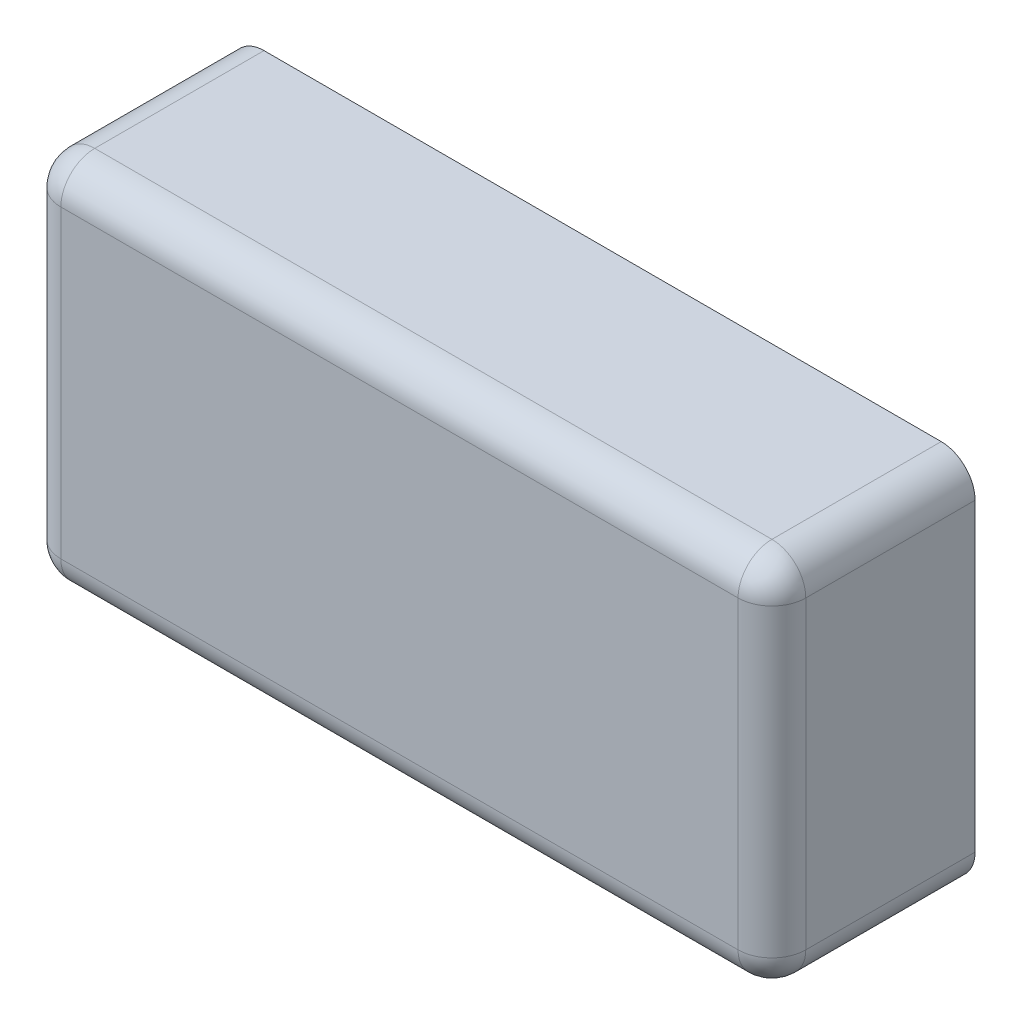
ISO-10303-21;
HEADER;
FILE_DESCRIPTION(('STEP AP214'),'2;1');
FILE_NAME('part.step','',(''),(''),'','','');
FILE_SCHEMA(('AUTOMOTIVE_DESIGN { 1 0 10303 214 1 1 1 1 }'));
ENDSEC;
DATA;
#1=APPLICATION_CONTEXT('core data for automotive mechanical design processes');
#2=APPLICATION_PROTOCOL_DEFINITION('international standard','automotive_design',2000,#1);
#3=PRODUCT_CONTEXT('',#1,'mechanical');
#4=PRODUCT('Part','Part','',(#3));
#5=PRODUCT_RELATED_PRODUCT_CATEGORY('part','',(#4));
#6=PRODUCT_DEFINITION_FORMATION('','',#4);
#7=PRODUCT_DEFINITION_CONTEXT('part definition',#1,'design');
#8=PRODUCT_DEFINITION('design','',#6,#7);
#9=PRODUCT_DEFINITION_SHAPE('','',#8);
#10=(LENGTH_UNIT() NAMED_UNIT(*) SI_UNIT(.MILLI.,.METRE.));
#11=(NAMED_UNIT(*) PLANE_ANGLE_UNIT() SI_UNIT($,.RADIAN.));
#12=(NAMED_UNIT(*) SI_UNIT($,.STERADIAN.) SOLID_ANGLE_UNIT());
#13=UNCERTAINTY_MEASURE_WITH_UNIT(LENGTH_MEASURE(1.E-05),#10,'distance_accuracy_value','');
#14=(GEOMETRIC_REPRESENTATION_CONTEXT(3) GLOBAL_UNCERTAINTY_ASSIGNED_CONTEXT((#13)) GLOBAL_UNIT_ASSIGNED_CONTEXT((#10,
#11,#12)) REPRESENTATION_CONTEXT('',''));
#15=CARTESIAN_POINT('',(0.,0.,0.));
#16=DIRECTION('',(0.,0.,1.));
#17=DIRECTION('',(1.,0.,0.));
#18=AXIS2_PLACEMENT_3D('',#15,#16,#17);
#19=CARTESIAN_POINT('',(-49.060650887574,24.5710059171598,30.));
#20=DIRECTION('',(1.,0.,0.));
#21=DIRECTION('',(0.,1.,0.));
#22=AXIS2_PLACEMENT_3D('',#19,#20,#21);
#23=PLANE('',#22);
#24=DIRECTION('',(0.,-1.,0.));
#25=VECTOR('',#24,1.);
#26=CARTESIAN_POINT('',(-49.060650887574,24.5710059171598,0.));
#27=LINE('',#26,#25);
#28=CARTESIAN_POINT('',(-49.060650887574,19.5710059171598,0.));
#29=VERTEX_POINT('',#28);
#30=CARTESIAN_POINT('',(-49.060650887574,-25.4289940828402,0.));
#31=VERTEX_POINT('',#30);
#32=EDGE_CURVE('E142',#29,#31,#27,.T.);
#33=ORIENTED_EDGE('',*,*,#32,.T.);
#34=DIRECTION('',(0.,0.,-1.));
#35=VECTOR('',#34,1.);
#36=CARTESIAN_POINT('',(-49.060650887574,-25.4289940828402,30.));
#37=LINE('',#36,#35);
#38=CARTESIAN_POINT('',(-49.060650887574,-25.4289940828402,25.));
#39=VERTEX_POINT('',#38);
#40=EDGE_CURVE('E159',#31,#39,#37,.F.);
#41=ORIENTED_EDGE('',*,*,#40,.T.);
#42=DIRECTION('',(0.,-1.,0.));
#43=VECTOR('',#42,1.);
#44=CARTESIAN_POINT('',(-49.060650887574,24.5710059171598,25.));
#45=LINE('',#44,#43);
#46=CARTESIAN_POINT('',(-49.060650887574,19.5710059171598,25.));
#47=VERTEX_POINT('',#46);
#48=EDGE_CURVE('E155',#39,#47,#45,.F.);
#49=ORIENTED_EDGE('',*,*,#48,.T.);
#50=DIRECTION('',(0.,0.,-1.));
#51=VECTOR('',#50,1.);
#52=CARTESIAN_POINT('',(-49.060650887574,19.5710059171598,30.));
#53=LINE('',#52,#51);
#54=EDGE_CURVE('E157',#47,#29,#53,.T.);
#55=ORIENTED_EDGE('',*,*,#54,.T.);
#56=EDGE_LOOP('',(#33,#41,#49,#55));
#57=FACE_BOUND('',#56,.T.);
#58=ADVANCED_FACE('F33',(#57),#23,.F.);
#59=CARTESIAN_POINT('',(-49.060650887574,-30.4289940828402,30.));
#60=DIRECTION('',(0.,1.,0.));
#61=DIRECTION('',(0.,0.,1.));
#62=AXIS2_PLACEMENT_3D('',#59,#60,#61);
#63=PLANE('',#62);
#64=DIRECTION('',(1.,0.,0.));
#65=VECTOR('',#64,1.);
#66=CARTESIAN_POINT('',(-49.060650887574,-30.4289940828402,0.));
#67=LINE('',#66,#65);
#68=CARTESIAN_POINT('',(-44.060650887574,-30.4289940828402,0.));
#69=VERTEX_POINT('',#68);
#70=CARTESIAN_POINT('',(55.939349112426,-30.4289940828402,0.));
#71=VERTEX_POINT('',#70);
#72=EDGE_CURVE('E138',#69,#71,#67,.T.);
#73=ORIENTED_EDGE('',*,*,#72,.T.);
#74=DIRECTION('',(0.,0.,-1.));
#75=VECTOR('',#74,1.);
#76=CARTESIAN_POINT('',(55.939349112426,-30.4289940828402,30.));
#77=LINE('',#76,#75);
#78=CARTESIAN_POINT('',(55.939349112426,-30.4289940828402,25.));
#79=VERTEX_POINT('',#78);
#80=EDGE_CURVE('E115',#71,#79,#77,.F.);
#81=ORIENTED_EDGE('',*,*,#80,.T.);
#82=DIRECTION('',(1.,0.,0.));
#83=VECTOR('',#82,1.);
#84=CARTESIAN_POINT('',(-49.060650887574,-30.4289940828402,25.));
#85=LINE('',#84,#83);
#86=CARTESIAN_POINT('',(-44.060650887574,-30.4289940828402,25.));
#87=VERTEX_POINT('',#86);
#88=EDGE_CURVE('E120',#79,#87,#85,.F.);
#89=ORIENTED_EDGE('',*,*,#88,.T.);
#90=DIRECTION('',(0.,0.,-1.));
#91=VECTOR('',#90,1.);
#92=CARTESIAN_POINT('',(-44.060650887574,-30.4289940828402,30.));
#93=LINE('',#92,#91);
#94=EDGE_CURVE('E152',#87,#69,#93,.T.);
#95=ORIENTED_EDGE('',*,*,#94,.T.);
#96=EDGE_LOOP('',(#73,#81,#89,#95));
#97=FACE_BOUND('',#96,.T.);
#98=ADVANCED_FACE('F248',(#97),#63,.F.);
#99=CARTESIAN_POINT('',(60.939349112426,24.5710059171598,30.));
#100=DIRECTION('',(-1.,0.,0.));
#101=DIRECTION('',(0.,0.,1.));
#102=AXIS2_PLACEMENT_3D('',#99,#100,#101);
#103=PLANE('',#102);
#104=DIRECTION('',(0.,1.,0.));
#105=VECTOR('',#104,1.);
#106=CARTESIAN_POINT('',(60.939349112426,-30.4289940828402,25.));
#107=LINE('',#106,#105);
#108=CARTESIAN_POINT('',(60.939349112426,19.5710059171598,25.));
#109=VERTEX_POINT('',#108);
#110=CARTESIAN_POINT('',(60.939349112426,-25.4289940828402,25.));
#111=VERTEX_POINT('',#110);
#112=EDGE_CURVE('E129',#109,#111,#107,.F.);
#113=ORIENTED_EDGE('',*,*,#112,.T.);
#114=DIRECTION('',(0.,0.,-1.));
#115=VECTOR('',#114,1.);
#116=CARTESIAN_POINT('',(60.939349112426,-25.4289940828402,30.));
#117=LINE('',#116,#115);
#118=CARTESIAN_POINT('',(60.939349112426,-25.4289940828402,0.));
#119=VERTEX_POINT('',#118);
#120=EDGE_CURVE('E114',#111,#119,#117,.T.);
#121=ORIENTED_EDGE('',*,*,#120,.T.);
#122=DIRECTION('',(0.,1.,0.));
#123=VECTOR('',#122,1.);
#124=CARTESIAN_POINT('',(60.939349112426,24.5710059171598,0.));
#125=LINE('',#124,#123);
#126=CARTESIAN_POINT('',(60.939349112426,19.5710059171598,0.));
#127=VERTEX_POINT('',#126);
#128=EDGE_CURVE('E126',#119,#127,#125,.T.);
#129=ORIENTED_EDGE('',*,*,#128,.T.);
#130=DIRECTION('',(0.,0.,-1.));
#131=VECTOR('',#130,1.);
#132=CARTESIAN_POINT('',(60.939349112426,19.5710059171598,30.));
#133=LINE('',#132,#131);
#134=EDGE_CURVE('E140',#127,#109,#133,.F.);
#135=ORIENTED_EDGE('',*,*,#134,.T.);
#136=EDGE_LOOP('',(#113,#121,#129,#135));
#137=FACE_BOUND('',#136,.T.);
#138=ADVANCED_FACE('F125',(#137),#103,.F.);
#139=CARTESIAN_POINT('',(-49.060650887574,24.5710059171598,30.));
#140=DIRECTION('',(0.,-1.,0.));
#141=DIRECTION('',(0.,0.,-1.));
#142=AXIS2_PLACEMENT_3D('',#139,#140,#141);
#143=PLANE('',#142);
#144=DIRECTION('',(-1.,0.,0.));
#145=VECTOR('',#144,1.);
#146=CARTESIAN_POINT('',(60.939349112426,24.5710059171598,25.));
#147=LINE('',#146,#145);
#148=CARTESIAN_POINT('',(-44.060650887574,24.5710059171598,25.));
#149=VERTEX_POINT('',#148);
#150=CARTESIAN_POINT('',(55.939349112426,24.5710059171598,25.));
#151=VERTEX_POINT('',#150);
#152=EDGE_CURVE('E49',#149,#151,#147,.F.);
#153=ORIENTED_EDGE('',*,*,#152,.T.);
#154=DIRECTION('',(0.,0.,-1.));
#155=VECTOR('',#154,1.);
#156=CARTESIAN_POINT('',(55.939349112426,24.5710059171598,30.));
#157=LINE('',#156,#155);
#158=CARTESIAN_POINT('',(55.939349112426,24.5710059171598,0.));
#159=VERTEX_POINT('',#158);
#160=EDGE_CURVE('E11',#151,#159,#157,.T.);
#161=ORIENTED_EDGE('',*,*,#160,.T.);
#162=DIRECTION('',(-1.,0.,0.));
#163=VECTOR('',#162,1.);
#164=CARTESIAN_POINT('',(-49.060650887574,24.5710059171598,0.));
#165=LINE('',#164,#163);
#166=CARTESIAN_POINT('',(-44.060650887574,24.5710059171598,0.));
#167=VERTEX_POINT('',#166);
#168=EDGE_CURVE('E137',#159,#167,#165,.T.);
#169=ORIENTED_EDGE('',*,*,#168,.T.);
#170=DIRECTION('',(0.,0.,-1.));
#171=VECTOR('',#170,1.);
#172=CARTESIAN_POINT('',(-44.060650887574,24.5710059171598,30.));
#173=LINE('',#172,#171);
#174=EDGE_CURVE('E42',#167,#149,#173,.F.);
#175=ORIENTED_EDGE('',*,*,#174,.T.);
#176=EDGE_LOOP('',(#153,#161,#169,#175));
#177=FACE_BOUND('',#176,.T.);
#178=ADVANCED_FACE('F226',(#177),#143,.F.);
#179=CARTESIAN_POINT('',(0.,0.,30.));
#180=DIRECTION('',(0.,0.,1.));
#181=DIRECTION('',(1.,0.,0.));
#182=AXIS2_PLACEMENT_3D('',#179,#180,#181);
#183=PLANE('',#182);
#184=DIRECTION('',(0.,-1.,0.));
#185=VECTOR('',#184,1.);
#186=CARTESIAN_POINT('',(-44.060650887574,-30.4289940828402,30.));
#187=LINE('',#186,#185);
#188=CARTESIAN_POINT('',(-44.060650887574,19.5710059171598,30.));
#189=VERTEX_POINT('',#188);
#190=CARTESIAN_POINT('',(-44.060650887574,-25.4289940828402,30.));
#191=VERTEX_POINT('',#190);
#192=EDGE_CURVE('E163',#189,#191,#187,.T.);
#193=ORIENTED_EDGE('',*,*,#192,.T.);
#194=DIRECTION('',(1.,0.,0.));
#195=VECTOR('',#194,1.);
#196=CARTESIAN_POINT('',(60.939349112426,-25.4289940828402,30.));
#197=LINE('',#196,#195);
#198=CARTESIAN_POINT('',(55.939349112426,-25.4289940828402,30.));
#199=VERTEX_POINT('',#198);
#200=EDGE_CURVE('E167',#191,#199,#197,.T.);
#201=ORIENTED_EDGE('',*,*,#200,.T.);
#202=DIRECTION('',(0.,1.,0.));
#203=VECTOR('',#202,1.);
#204=CARTESIAN_POINT('',(55.939349112426,24.5710059171598,30.));
#205=LINE('',#204,#203);
#206=CARTESIAN_POINT('',(55.939349112426,19.5710059171598,30.));
#207=VERTEX_POINT('',#206);
#208=EDGE_CURVE('E165',#199,#207,#205,.T.);
#209=ORIENTED_EDGE('',*,*,#208,.T.);
#210=DIRECTION('',(-1.,0.,0.));
#211=VECTOR('',#210,1.);
#212=CARTESIAN_POINT('',(-49.060650887574,19.5710059171598,30.));
#213=LINE('',#212,#211);
#214=EDGE_CURVE('E161',#207,#189,#213,.T.);
#215=ORIENTED_EDGE('',*,*,#214,.T.);
#216=EDGE_LOOP('',(#193,#201,#209,#215));
#217=FACE_BOUND('',#216,.T.);
#218=ADVANCED_FACE('F286',(#217),#183,.T.);
#219=CARTESIAN_POINT('',(0.,0.,0.));
#220=DIRECTION('',(0.,0.,1.));
#221=DIRECTION('',(1.,0.,0.));
#222=AXIS2_PLACEMENT_3D('',#219,#220,#221);
#223=PLANE('',#222);
#224=ORIENTED_EDGE('',*,*,#128,.F.);
#225=CARTESIAN_POINT('',(55.939349112426,-25.4289940828402,0.));
#226=DIRECTION('',(0.,0.,1.));
#227=DIRECTION('',(1.,0.,0.));
#228=AXIS2_PLACEMENT_3D('',#225,#226,#227);
#229=CIRCLE('',#228,5.);
#230=EDGE_CURVE('E110',#119,#71,#229,.F.);
#231=ORIENTED_EDGE('',*,*,#230,.T.);
#232=ORIENTED_EDGE('',*,*,#72,.F.);
#233=CARTESIAN_POINT('',(-44.060650887574,-25.4289940828402,0.));
#234=DIRECTION('',(0.,0.,1.));
#235=DIRECTION('',(1.,0.,0.));
#236=AXIS2_PLACEMENT_3D('',#233,#234,#235);
#237=CIRCLE('',#236,5.);
#238=EDGE_CURVE('E121',#69,#31,#237,.F.);
#239=ORIENTED_EDGE('',*,*,#238,.T.);
#240=ORIENTED_EDGE('',*,*,#32,.F.);
#241=CARTESIAN_POINT('',(-44.060650887574,19.5710059171598,0.));
#242=DIRECTION('',(0.,0.,1.));
#243=DIRECTION('',(1.,0.,0.));
#244=AXIS2_PLACEMENT_3D('',#241,#242,#243);
#245=CIRCLE('',#244,5.);
#246=EDGE_CURVE('E131',#29,#167,#245,.F.);
#247=ORIENTED_EDGE('',*,*,#246,.T.);
#248=ORIENTED_EDGE('',*,*,#168,.F.);
#249=CARTESIAN_POINT('',(55.939349112426,19.5710059171598,0.));
#250=DIRECTION('',(0.,0.,1.));
#251=DIRECTION('',(1.,0.,0.));
#252=AXIS2_PLACEMENT_3D('',#249,#250,#251);
#253=CIRCLE('',#252,5.);
#254=EDGE_CURVE('E136',#159,#127,#253,.F.);
#255=ORIENTED_EDGE('',*,*,#254,.T.);
#256=EDGE_LOOP('',(#224,#231,#232,#239,#240,#247,#248,#255));
#257=FACE_BOUND('',#256,.T.);
#258=ADVANCED_FACE('F133',(#257),#223,.F.);
#259=CARTESIAN_POINT('',(-44.060650887574,19.5710059171598,30.));
#260=DIRECTION('',(0.,0.,-1.));
#261=DIRECTION('',(-1.,0.,0.));
#262=AXIS2_PLACEMENT_3D('',#259,#260,#261);
#263=CYLINDRICAL_SURFACE('',#262,5.);
#264=CARTESIAN_POINT('',(-44.060650887574,19.5710059171598,25.));
#265=DIRECTION('',(0.,0.,1.));
#266=DIRECTION('',(1.,0.,0.));
#267=AXIS2_PLACEMENT_3D('',#264,#265,#266);
#268=CIRCLE('',#267,5.);
#269=EDGE_CURVE('E37',#149,#47,#268,.T.);
#270=ORIENTED_EDGE('',*,*,#269,.F.);
#271=ORIENTED_EDGE('',*,*,#174,.F.);
#272=ORIENTED_EDGE('',*,*,#246,.F.);
#273=ORIENTED_EDGE('',*,*,#54,.F.);
#274=EDGE_LOOP('',(#270,#271,#272,#273));
#275=FACE_BOUND('',#274,.T.);
#276=ADVANCED_FACE('F35',(#275),#263,.T.);
#277=CARTESIAN_POINT('',(-44.060650887574,19.5710059171598,25.));
#278=DIRECTION('',(0.,0.,1.));
#279=DIRECTION('',(1.,0.,0.));
#280=AXIS2_PLACEMENT_3D('',#277,#278,#279);
#281=SPHERICAL_SURFACE('',#280,5.);
#282=CARTESIAN_POINT('',(-44.060650887574,19.5710059171598,25.));
#283=DIRECTION('',(-1.,0.,0.));
#284=DIRECTION('',(0.,0.,1.));
#285=AXIS2_PLACEMENT_3D('',#282,#283,#284);
#286=CIRCLE('',#285,5.);
#287=EDGE_CURVE('E197',#149,#189,#286,.F.);
#288=ORIENTED_EDGE('',*,*,#287,.F.);
#289=ORIENTED_EDGE('',*,*,#269,.T.);
#290=CARTESIAN_POINT('',(-44.060650887574,19.5710059171598,25.));
#291=DIRECTION('',(0.,1.,0.));
#292=DIRECTION('',(0.,0.,1.));
#293=AXIS2_PLACEMENT_3D('',#290,#291,#292);
#294=CIRCLE('',#293,5.);
#295=EDGE_CURVE('E199',#189,#47,#294,.F.);
#296=ORIENTED_EDGE('',*,*,#295,.F.);
#297=EDGE_LOOP('',(#288,#289,#296));
#298=FACE_BOUND('',#297,.T.);
#299=ADVANCED_FACE('F278',(#298),#281,.T.);
#300=CARTESIAN_POINT('',(-44.060650887574,-25.4289940828402,30.));
#301=DIRECTION('',(0.,0.,-1.));
#302=DIRECTION('',(-1.,0.,0.));
#303=AXIS2_PLACEMENT_3D('',#300,#301,#302);
#304=CYLINDRICAL_SURFACE('',#303,5.);
#305=ORIENTED_EDGE('',*,*,#238,.F.);
#306=ORIENTED_EDGE('',*,*,#94,.F.);
#307=CARTESIAN_POINT('',(-44.060650887574,-25.4289940828402,25.));
#308=DIRECTION('',(0.,0.,1.));
#309=DIRECTION('',(1.,0.,0.));
#310=AXIS2_PLACEMENT_3D('',#307,#308,#309);
#311=CIRCLE('',#310,5.);
#312=EDGE_CURVE('E194',#39,#87,#311,.T.);
#313=ORIENTED_EDGE('',*,*,#312,.F.);
#314=ORIENTED_EDGE('',*,*,#40,.F.);
#315=EDGE_LOOP('',(#305,#306,#313,#314));
#316=FACE_BOUND('',#315,.T.);
#317=ADVANCED_FACE('F217',(#316),#304,.T.);
#318=CARTESIAN_POINT('',(-44.060650887574,0.,25.));
#319=DIRECTION('',(0.,1.,0.));
#320=DIRECTION('',(-1.,0.,0.));
#321=AXIS2_PLACEMENT_3D('',#318,#319,#320);
#322=CYLINDRICAL_SURFACE('',#321,5.);
#323=ORIENTED_EDGE('',*,*,#295,.T.);
#324=ORIENTED_EDGE('',*,*,#48,.F.);
#325=CARTESIAN_POINT('',(-44.060650887574,-25.4289940828402,25.));
#326=DIRECTION('',(0.,-1.,0.));
#327=DIRECTION('',(0.,0.,-1.));
#328=AXIS2_PLACEMENT_3D('',#325,#326,#327);
#329=CIRCLE('',#328,5.);
#330=EDGE_CURVE('E191',#191,#39,#329,.T.);
#331=ORIENTED_EDGE('',*,*,#330,.F.);
#332=ORIENTED_EDGE('',*,*,#192,.F.);
#333=EDGE_LOOP('',(#323,#324,#331,#332));
#334=FACE_BOUND('',#333,.T.);
#335=ADVANCED_FACE('F224',(#334),#322,.T.);
#336=CARTESIAN_POINT('',(0.,19.5710059171598,25.));
#337=DIRECTION('',(1.,0.,0.));
#338=DIRECTION('',(0.,0.,-1.));
#339=AXIS2_PLACEMENT_3D('',#336,#337,#338);
#340=CYLINDRICAL_SURFACE('',#339,5.);
#341=ORIENTED_EDGE('',*,*,#287,.T.);
#342=ORIENTED_EDGE('',*,*,#214,.F.);
#343=CARTESIAN_POINT('',(55.939349112426,19.5710059171598,25.));
#344=DIRECTION('',(1.,0.,0.));
#345=DIRECTION('',(0.,0.,-1.));
#346=AXIS2_PLACEMENT_3D('',#343,#344,#345);
#347=CIRCLE('',#346,5.);
#348=EDGE_CURVE('E188',#151,#207,#347,.T.);
#349=ORIENTED_EDGE('',*,*,#348,.F.);
#350=ORIENTED_EDGE('',*,*,#152,.F.);
#351=EDGE_LOOP('',(#341,#342,#349,#350));
#352=FACE_BOUND('',#351,.T.);
#353=ADVANCED_FACE('F234',(#352),#340,.T.);
#354=CARTESIAN_POINT('',(55.939349112426,19.5710059171598,30.));
#355=DIRECTION('',(0.,0.,-1.));
#356=DIRECTION('',(-1.,0.,0.));
#357=AXIS2_PLACEMENT_3D('',#354,#355,#356);
#358=CYLINDRICAL_SURFACE('',#357,5.);
#359=ORIENTED_EDGE('',*,*,#254,.F.);
#360=ORIENTED_EDGE('',*,*,#160,.F.);
#361=CARTESIAN_POINT('',(55.939349112426,19.5710059171598,25.));
#362=DIRECTION('',(0.,0.,1.));
#363=DIRECTION('',(1.,0.,0.));
#364=AXIS2_PLACEMENT_3D('',#361,#362,#363);
#365=CIRCLE('',#364,5.);
#366=EDGE_CURVE('E185',#109,#151,#365,.T.);
#367=ORIENTED_EDGE('',*,*,#366,.F.);
#368=ORIENTED_EDGE('',*,*,#134,.F.);
#369=EDGE_LOOP('',(#359,#360,#367,#368));
#370=FACE_BOUND('',#369,.T.);
#371=ADVANCED_FACE('F230',(#370),#358,.T.);
#372=CARTESIAN_POINT('',(-44.060650887574,-25.4289940828402,25.));
#373=DIRECTION('',(0.,0.,1.));
#374=DIRECTION('',(1.,0.,0.));
#375=AXIS2_PLACEMENT_3D('',#372,#373,#374);
#376=SPHERICAL_SURFACE('',#375,5.);
#377=ORIENTED_EDGE('',*,*,#330,.T.);
#378=ORIENTED_EDGE('',*,*,#312,.T.);
#379=CARTESIAN_POINT('',(-44.060650887574,-25.4289940828402,25.));
#380=DIRECTION('',(-1.,0.,0.));
#381=DIRECTION('',(0.,0.,1.));
#382=AXIS2_PLACEMENT_3D('',#379,#380,#381);
#383=CIRCLE('',#382,5.);
#384=EDGE_CURVE('E182',#191,#87,#383,.F.);
#385=ORIENTED_EDGE('',*,*,#384,.F.);
#386=EDGE_LOOP('',(#377,#378,#385));
#387=FACE_BOUND('',#386,.T.);
#388=ADVANCED_FACE('F222',(#387),#376,.T.);
#389=CARTESIAN_POINT('',(55.939349112426,19.5710059171598,25.));
#390=DIRECTION('',(0.,0.,1.));
#391=DIRECTION('',(1.,0.,0.));
#392=AXIS2_PLACEMENT_3D('',#389,#390,#391);
#393=SPHERICAL_SURFACE('',#392,5.);
#394=ORIENTED_EDGE('',*,*,#366,.T.);
#395=ORIENTED_EDGE('',*,*,#348,.T.);
#396=CARTESIAN_POINT('',(55.939349112426,19.5710059171598,25.));
#397=DIRECTION('',(0.,1.,0.));
#398=DIRECTION('',(0.,0.,1.));
#399=AXIS2_PLACEMENT_3D('',#396,#397,#398);
#400=CIRCLE('',#399,5.);
#401=EDGE_CURVE('E179',#109,#207,#400,.F.);
#402=ORIENTED_EDGE('',*,*,#401,.F.);
#403=EDGE_LOOP('',(#394,#395,#402));
#404=FACE_BOUND('',#403,.T.);
#405=ADVANCED_FACE('F236',(#404),#393,.T.);
#406=CARTESIAN_POINT('',(0.,-25.4289940828402,25.));
#407=DIRECTION('',(-1.,0.,0.));
#408=DIRECTION('',(0.,0.,1.));
#409=AXIS2_PLACEMENT_3D('',#406,#407,#408);
#410=CYLINDRICAL_SURFACE('',#409,5.);
#411=ORIENTED_EDGE('',*,*,#384,.T.);
#412=ORIENTED_EDGE('',*,*,#88,.F.);
#413=CARTESIAN_POINT('',(55.939349112426,-25.4289940828402,25.));
#414=DIRECTION('',(1.,0.,0.));
#415=DIRECTION('',(0.,0.,-1.));
#416=AXIS2_PLACEMENT_3D('',#413,#414,#415);
#417=CIRCLE('',#416,5.);
#418=EDGE_CURVE('E176',#199,#79,#417,.T.);
#419=ORIENTED_EDGE('',*,*,#418,.F.);
#420=ORIENTED_EDGE('',*,*,#200,.F.);
#421=EDGE_LOOP('',(#411,#412,#419,#420));
#422=FACE_BOUND('',#421,.T.);
#423=ADVANCED_FACE('F246',(#422),#410,.T.);
#424=CARTESIAN_POINT('',(55.939349112426,0.,25.));
#425=DIRECTION('',(0.,-1.,0.));
#426=DIRECTION('',(0.,0.,-1.));
#427=AXIS2_PLACEMENT_3D('',#424,#425,#426);
#428=CYLINDRICAL_SURFACE('',#427,5.);
#429=ORIENTED_EDGE('',*,*,#401,.T.);
#430=ORIENTED_EDGE('',*,*,#208,.F.);
#431=CARTESIAN_POINT('',(55.939349112426,-25.4289940828402,25.));
#432=DIRECTION('',(0.,-1.,0.));
#433=DIRECTION('',(0.,0.,-1.));
#434=AXIS2_PLACEMENT_3D('',#431,#432,#433);
#435=CIRCLE('',#434,5.);
#436=EDGE_CURVE('E174',#111,#199,#435,.T.);
#437=ORIENTED_EDGE('',*,*,#436,.F.);
#438=ORIENTED_EDGE('',*,*,#112,.F.);
#439=EDGE_LOOP('',(#429,#430,#437,#438));
#440=FACE_BOUND('',#439,.T.);
#441=ADVANCED_FACE('F239',(#440),#428,.T.);
#442=CARTESIAN_POINT('',(55.939349112426,-25.4289940828402,25.));
#443=DIRECTION('',(0.,0.,1.));
#444=DIRECTION('',(1.,0.,0.));
#445=AXIS2_PLACEMENT_3D('',#442,#443,#444);
#446=SPHERICAL_SURFACE('',#445,5.);
#447=ORIENTED_EDGE('',*,*,#436,.T.);
#448=ORIENTED_EDGE('',*,*,#418,.T.);
#449=CARTESIAN_POINT('',(55.939349112426,-25.4289940828402,25.));
#450=DIRECTION('',(0.,0.,1.));
#451=DIRECTION('',(1.,0.,0.));
#452=AXIS2_PLACEMENT_3D('',#449,#450,#451);
#453=CIRCLE('',#452,5.);
#454=EDGE_CURVE('E172',#111,#79,#453,.F.);
#455=ORIENTED_EDGE('',*,*,#454,.F.);
#456=EDGE_LOOP('',(#447,#448,#455));
#457=FACE_BOUND('',#456,.T.);
#458=ADVANCED_FACE('F243',(#457),#446,.T.);
#459=CARTESIAN_POINT('',(55.939349112426,-25.4289940828402,30.));
#460=DIRECTION('',(0.,0.,-1.));
#461=DIRECTION('',(-1.,0.,0.));
#462=AXIS2_PLACEMENT_3D('',#459,#460,#461);
#463=CYLINDRICAL_SURFACE('',#462,5.);
#464=ORIENTED_EDGE('',*,*,#454,.T.);
#465=ORIENTED_EDGE('',*,*,#80,.F.);
#466=ORIENTED_EDGE('',*,*,#230,.F.);
#467=ORIENTED_EDGE('',*,*,#120,.F.);
#468=EDGE_LOOP('',(#464,#465,#466,#467));
#469=FACE_BOUND('',#468,.T.);
#470=ADVANCED_FACE('F113',(#469),#463,.T.);
#471=CLOSED_SHELL('',(#58,#98,#138,#178,#218,#258,#276,#299,#317,#335,#353,#371,#388,#405,#423,
#441,#458,#470));
#472=MANIFOLD_SOLID_BREP('B2',#471);
#473=ADVANCED_BREP_SHAPE_REPRESENTATION('',(#18,#472),#14);
#474=SHAPE_DEFINITION_REPRESENTATION(#9,#473);
ENDSEC;
END-ISO-10303-21;
